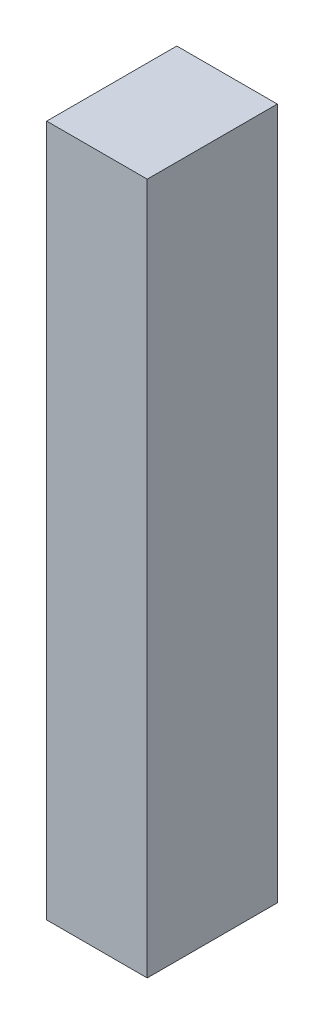
ISO-10303-21;
HEADER;
FILE_DESCRIPTION(('STEP AP214'),'2;1');
FILE_NAME('part.step','',(''),(''),'','','');
FILE_SCHEMA(('AUTOMOTIVE_DESIGN { 1 0 10303 214 1 1 1 1 }'));
ENDSEC;
DATA;
#1=APPLICATION_CONTEXT('core data for automotive mechanical design processes');
#2=APPLICATION_PROTOCOL_DEFINITION('international standard','automotive_design',2000,#1);
#3=PRODUCT_CONTEXT('',#1,'mechanical');
#4=PRODUCT('Part','Part','',(#3));
#5=PRODUCT_RELATED_PRODUCT_CATEGORY('part','',(#4));
#6=PRODUCT_DEFINITION_FORMATION('','',#4);
#7=PRODUCT_DEFINITION_CONTEXT('part definition',#1,'design');
#8=PRODUCT_DEFINITION('design','',#6,#7);
#9=PRODUCT_DEFINITION_SHAPE('','',#8);
#10=(LENGTH_UNIT() NAMED_UNIT(*) SI_UNIT(.MILLI.,.METRE.));
#11=(NAMED_UNIT(*) PLANE_ANGLE_UNIT() SI_UNIT($,.RADIAN.));
#12=(NAMED_UNIT(*) SI_UNIT($,.STERADIAN.) SOLID_ANGLE_UNIT());
#13=UNCERTAINTY_MEASURE_WITH_UNIT(LENGTH_MEASURE(1.E-05),#10,'distance_accuracy_value','');
#14=(GEOMETRIC_REPRESENTATION_CONTEXT(3) GLOBAL_UNCERTAINTY_ASSIGNED_CONTEXT((#13)) GLOBAL_UNIT_ASSIGNED_CONTEXT((#10,
#11,#12)) REPRESENTATION_CONTEXT('',''));
#15=CARTESIAN_POINT('',(0.,0.,0.));
#16=DIRECTION('',(0.,0.,1.));
#17=DIRECTION('',(1.,0.,0.));
#18=AXIS2_PLACEMENT_3D('',#15,#16,#17);
#19=CARTESIAN_POINT('',(0.,117.,0.));
#20=DIRECTION('',(1.,0.,0.));
#21=DIRECTION('',(0.,0.,-1.));
#22=AXIS2_PLACEMENT_3D('',#19,#20,#21);
#23=PLANE('',#22);
#24=DIRECTION('',(0.,0.,1.));
#25=VECTOR('',#24,1.);
#26=CARTESIAN_POINT('',(0.,0.,0.));
#27=LINE('',#26,#25);
#28=CARTESIAN_POINT('',(0.,0.,-22.));
#29=VERTEX_POINT('',#28);
#30=CARTESIAN_POINT('',(0.,0.,0.));
#31=VERTEX_POINT('',#30);
#32=EDGE_CURVE('E102',#29,#31,#27,.T.);
#33=ORIENTED_EDGE('',*,*,#32,.T.);
#34=DIRECTION('',(0.,-1.,0.));
#35=VECTOR('',#34,1.);
#36=CARTESIAN_POINT('',(0.,117.,0.));
#37=LINE('',#36,#35);
#38=CARTESIAN_POINT('',(0.,117.,0.));
#39=VERTEX_POINT('',#38);
#40=EDGE_CURVE('E11',#39,#31,#37,.T.);
#41=ORIENTED_EDGE('',*,*,#40,.F.);
#42=DIRECTION('',(0.,0.,1.));
#43=VECTOR('',#42,1.);
#44=CARTESIAN_POINT('',(0.,117.,0.));
#45=LINE('',#44,#43);
#46=CARTESIAN_POINT('',(0.,117.,-22.));
#47=VERTEX_POINT('',#46);
#48=EDGE_CURVE('E95',#47,#39,#45,.T.);
#49=ORIENTED_EDGE('',*,*,#48,.F.);
#50=DIRECTION('',(0.,-1.,0.));
#51=VECTOR('',#50,1.);
#52=CARTESIAN_POINT('',(0.,117.,-22.));
#53=LINE('',#52,#51);
#54=EDGE_CURVE('E99',#47,#29,#53,.T.);
#55=ORIENTED_EDGE('',*,*,#54,.T.);
#56=EDGE_LOOP('',(#33,#41,#49,#55));
#57=FACE_BOUND('',#56,.T.);
#58=ADVANCED_FACE('F41',(#57),#23,.F.);
#59=CARTESIAN_POINT('',(0.,117.,0.));
#60=DIRECTION('',(0.,0.,-1.));
#61=DIRECTION('',(-1.,0.,0.));
#62=AXIS2_PLACEMENT_3D('',#59,#60,#61);
#63=PLANE('',#62);
#64=DIRECTION('',(1.,0.,0.));
#65=VECTOR('',#64,1.);
#66=CARTESIAN_POINT('',(0.,0.,0.));
#67=LINE('',#66,#65);
#68=CARTESIAN_POINT('',(17.,0.,0.));
#69=VERTEX_POINT('',#68);
#70=EDGE_CURVE('E96',#31,#69,#67,.T.);
#71=ORIENTED_EDGE('',*,*,#70,.T.);
#72=DIRECTION('',(0.,-1.,0.));
#73=VECTOR('',#72,1.);
#74=CARTESIAN_POINT('',(17.,117.,0.));
#75=LINE('',#74,#73);
#76=CARTESIAN_POINT('',(17.,117.,0.));
#77=VERTEX_POINT('',#76);
#78=EDGE_CURVE('E47',#77,#69,#75,.T.);
#79=ORIENTED_EDGE('',*,*,#78,.F.);
#80=DIRECTION('',(1.,0.,0.));
#81=VECTOR('',#80,1.);
#82=CARTESIAN_POINT('',(0.,117.,0.));
#83=LINE('',#82,#81);
#84=EDGE_CURVE('E87',#39,#77,#83,.T.);
#85=ORIENTED_EDGE('',*,*,#84,.F.);
#86=ORIENTED_EDGE('',*,*,#40,.T.);
#87=EDGE_LOOP('',(#71,#79,#85,#86));
#88=FACE_BOUND('',#87,.T.);
#89=ADVANCED_FACE('F92',(#88),#63,.F.);
#90=CARTESIAN_POINT('',(17.,117.,0.));
#91=DIRECTION('',(-1.,0.,0.));
#92=DIRECTION('',(0.,0.,1.));
#93=AXIS2_PLACEMENT_3D('',#90,#91,#92);
#94=PLANE('',#93);
#95=DIRECTION('',(0.,0.,-1.));
#96=VECTOR('',#95,1.);
#97=CARTESIAN_POINT('',(17.,0.,0.));
#98=LINE('',#97,#96);
#99=CARTESIAN_POINT('',(17.,0.,-22.));
#100=VERTEX_POINT('',#99);
#101=EDGE_CURVE('E74',#69,#100,#98,.T.);
#102=ORIENTED_EDGE('',*,*,#101,.T.);
#103=DIRECTION('',(0.,-1.,0.));
#104=VECTOR('',#103,1.);
#105=CARTESIAN_POINT('',(17.,117.,-22.));
#106=LINE('',#105,#104);
#107=CARTESIAN_POINT('',(17.,117.,-22.));
#108=VERTEX_POINT('',#107);
#109=EDGE_CURVE('E100',#108,#100,#106,.T.);
#110=ORIENTED_EDGE('',*,*,#109,.F.);
#111=DIRECTION('',(0.,0.,-1.));
#112=VECTOR('',#111,1.);
#113=CARTESIAN_POINT('',(17.,117.,0.));
#114=LINE('',#113,#112);
#115=EDGE_CURVE('E89',#77,#108,#114,.T.);
#116=ORIENTED_EDGE('',*,*,#115,.F.);
#117=ORIENTED_EDGE('',*,*,#78,.T.);
#118=EDGE_LOOP('',(#102,#110,#116,#117));
#119=FACE_BOUND('',#118,.T.);
#120=ADVANCED_FACE('F98',(#119),#94,.F.);
#121=CARTESIAN_POINT('',(0.,117.,-22.));
#122=DIRECTION('',(0.,0.,1.));
#123=DIRECTION('',(1.,0.,0.));
#124=AXIS2_PLACEMENT_3D('',#121,#122,#123);
#125=PLANE('',#124);
#126=DIRECTION('',(-1.,0.,0.));
#127=VECTOR('',#126,1.);
#128=CARTESIAN_POINT('',(0.,0.,-22.));
#129=LINE('',#128,#127);
#130=EDGE_CURVE('E78',#100,#29,#129,.T.);
#131=ORIENTED_EDGE('',*,*,#130,.T.);
#132=ORIENTED_EDGE('',*,*,#54,.F.);
#133=DIRECTION('',(-1.,0.,0.));
#134=VECTOR('',#133,1.);
#135=CARTESIAN_POINT('',(0.,117.,-22.));
#136=LINE('',#135,#134);
#137=EDGE_CURVE('E60',#108,#47,#136,.T.);
#138=ORIENTED_EDGE('',*,*,#137,.F.);
#139=ORIENTED_EDGE('',*,*,#109,.T.);
#140=EDGE_LOOP('',(#131,#132,#138,#139));
#141=FACE_BOUND('',#140,.T.);
#142=ADVANCED_FACE('F112',(#141),#125,.F.);
#143=CARTESIAN_POINT('',(0.,117.,0.));
#144=DIRECTION('',(0.,-1.,0.));
#145=DIRECTION('',(0.,0.,-1.));
#146=AXIS2_PLACEMENT_3D('',#143,#144,#145);
#147=PLANE('',#146);
#148=ORIENTED_EDGE('',*,*,#48,.T.);
#149=ORIENTED_EDGE('',*,*,#84,.T.);
#150=ORIENTED_EDGE('',*,*,#115,.T.);
#151=ORIENTED_EDGE('',*,*,#137,.T.);
#152=EDGE_LOOP('',(#148,#149,#150,#151));
#153=FACE_BOUND('',#152,.T.);
#154=ADVANCED_FACE('F86',(#153),#147,.F.);
#155=CARTESIAN_POINT('',(0.,0.,0.));
#156=DIRECTION('',(0.,-1.,0.));
#157=DIRECTION('',(0.,0.,-1.));
#158=AXIS2_PLACEMENT_3D('',#155,#156,#157);
#159=PLANE('',#158);
#160=ORIENTED_EDGE('',*,*,#32,.F.);
#161=ORIENTED_EDGE('',*,*,#130,.F.);
#162=ORIENTED_EDGE('',*,*,#101,.F.);
#163=ORIENTED_EDGE('',*,*,#70,.F.);
#164=EDGE_LOOP('',(#160,#161,#162,#163));
#165=FACE_BOUND('',#164,.T.);
#166=ADVANCED_FACE('F111',(#165),#159,.T.);
#167=CLOSED_SHELL('',(#58,#89,#120,#142,#154,#166));
#168=MANIFOLD_SOLID_BREP('B2',#167);
#169=ADVANCED_BREP_SHAPE_REPRESENTATION('',(#18,#168),#14);
#170=SHAPE_DEFINITION_REPRESENTATION(#9,#169);
ENDSEC;
END-ISO-10303-21;
